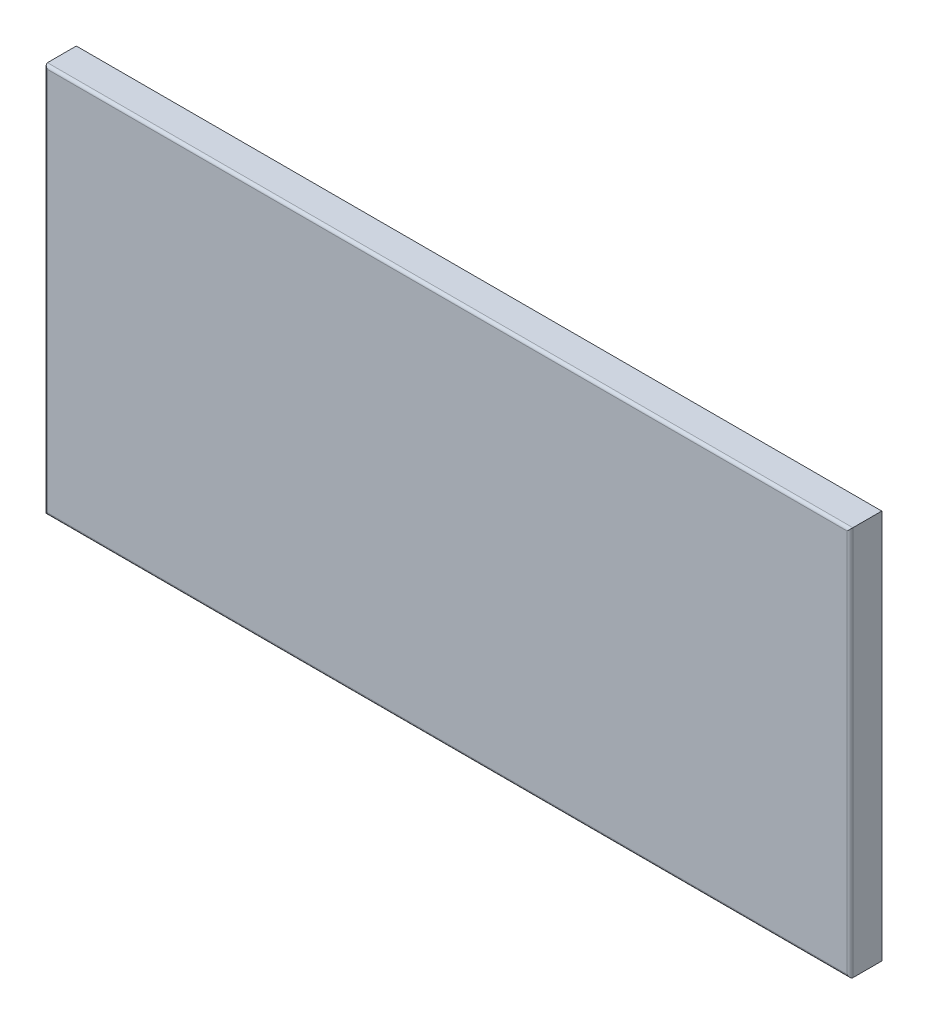
ISO-10303-21;
HEADER;
FILE_DESCRIPTION(('STEP AP214'),'2;1');
FILE_NAME('part.step','',(''),(''),'','','');
FILE_SCHEMA(('AUTOMOTIVE_DESIGN { 1 0 10303 214 1 1 1 1 }'));
ENDSEC;
DATA;
#1=APPLICATION_CONTEXT('core data for automotive mechanical design processes');
#2=APPLICATION_PROTOCOL_DEFINITION('international standard','automotive_design',2000,#1);
#3=PRODUCT_CONTEXT('',#1,'mechanical');
#4=PRODUCT('Part','Part','',(#3));
#5=PRODUCT_RELATED_PRODUCT_CATEGORY('part','',(#4));
#6=PRODUCT_DEFINITION_FORMATION('','',#4);
#7=PRODUCT_DEFINITION_CONTEXT('part definition',#1,'design');
#8=PRODUCT_DEFINITION('design','',#6,#7);
#9=PRODUCT_DEFINITION_SHAPE('','',#8);
#10=(LENGTH_UNIT() NAMED_UNIT(*) SI_UNIT(.MILLI.,.METRE.));
#11=(NAMED_UNIT(*) PLANE_ANGLE_UNIT() SI_UNIT($,.RADIAN.));
#12=(NAMED_UNIT(*) SI_UNIT($,.STERADIAN.) SOLID_ANGLE_UNIT());
#13=UNCERTAINTY_MEASURE_WITH_UNIT(LENGTH_MEASURE(1.E-05),#10,'distance_accuracy_value','');
#14=(GEOMETRIC_REPRESENTATION_CONTEXT(3) GLOBAL_UNCERTAINTY_ASSIGNED_CONTEXT((#13)) GLOBAL_UNIT_ASSIGNED_CONTEXT((#10,
#11,#12)) REPRESENTATION_CONTEXT('',''));
#15=CARTESIAN_POINT('',(0.,0.,0.));
#16=DIRECTION('',(0.,0.,1.));
#17=DIRECTION('',(1.,0.,0.));
#18=AXIS2_PLACEMENT_3D('',#15,#16,#17);
#19=CARTESIAN_POINT('',(0.,0.,1.1));
#20=DIRECTION('',(1.,0.,0.));
#21=DIRECTION('',(0.,1.,0.));
#22=AXIS2_PLACEMENT_3D('',#19,#20,#21);
#23=PLANE('',#22);
#24=DIRECTION('',(0.,0.,-1.));
#25=VECTOR('',#24,1.);
#26=CARTESIAN_POINT('',(0.,0.,1.1));
#27=LINE('',#26,#25);
#28=CARTESIAN_POINT('',(0.,0.,1.));
#29=VERTEX_POINT('',#28);
#30=CARTESIAN_POINT('',(0.,0.,0.));
#31=VERTEX_POINT('',#30);
#32=EDGE_CURVE('E90',#29,#31,#27,.T.);
#33=ORIENTED_EDGE('',*,*,#32,.F.);
#34=DIRECTION('',(0.,-1.,0.));
#35=VECTOR('',#34,1.);
#36=CARTESIAN_POINT('',(0.,0.,1.));
#37=LINE('',#36,#35);
#38=CARTESIAN_POINT('',(0.,13.5,1.));
#39=VERTEX_POINT('',#38);
#40=EDGE_CURVE('E48',#29,#39,#37,.F.);
#41=ORIENTED_EDGE('',*,*,#40,.T.);
#42=DIRECTION('',(0.,0.,-1.));
#43=VECTOR('',#42,1.);
#44=CARTESIAN_POINT('',(0.,13.5,1.1));
#45=LINE('',#44,#43);
#46=CARTESIAN_POINT('',(0.,13.5,0.));
#47=VERTEX_POINT('',#46);
#48=EDGE_CURVE('E109',#39,#47,#45,.T.);
#49=ORIENTED_EDGE('',*,*,#48,.T.);
#50=DIRECTION('',(0.,-1.,0.));
#51=VECTOR('',#50,1.);
#52=CARTESIAN_POINT('',(0.,0.,0.));
#53=LINE('',#52,#51);
#54=EDGE_CURVE('E104',#47,#31,#53,.T.);
#55=ORIENTED_EDGE('',*,*,#54,.T.);
#56=EDGE_LOOP('',(#33,#41,#49,#55));
#57=FACE_BOUND('',#56,.T.);
#58=ADVANCED_FACE('F38',(#57),#23,.F.);
#59=CARTESIAN_POINT('',(0.,0.,1.1));
#60=DIRECTION('',(0.,1.,0.));
#61=DIRECTION('',(0.,0.,1.));
#62=AXIS2_PLACEMENT_3D('',#59,#60,#61);
#63=PLANE('',#62);
#64=DIRECTION('',(0.,0.,-1.));
#65=VECTOR('',#64,1.);
#66=CARTESIAN_POINT('',(27.9,0.,1.1));
#67=LINE('',#66,#65);
#68=CARTESIAN_POINT('',(27.9,0.,1.));
#69=VERTEX_POINT('',#68);
#70=CARTESIAN_POINT('',(27.9,0.,0.));
#71=VERTEX_POINT('',#70);
#72=EDGE_CURVE('E98',#69,#71,#67,.T.);
#73=ORIENTED_EDGE('',*,*,#72,.F.);
#74=DIRECTION('',(1.,0.,0.));
#75=VECTOR('',#74,1.);
#76=CARTESIAN_POINT('',(0.,0.,1.));
#77=LINE('',#76,#75);
#78=EDGE_CURVE('E11',#69,#29,#77,.F.);
#79=ORIENTED_EDGE('',*,*,#78,.T.);
#80=ORIENTED_EDGE('',*,*,#32,.T.);
#81=DIRECTION('',(1.,0.,0.));
#82=VECTOR('',#81,1.);
#83=CARTESIAN_POINT('',(0.,0.,0.));
#84=LINE('',#83,#82);
#85=EDGE_CURVE('E93',#31,#71,#84,.T.);
#86=ORIENTED_EDGE('',*,*,#85,.T.);
#87=EDGE_LOOP('',(#73,#79,#80,#86));
#88=FACE_BOUND('',#87,.T.);
#89=ADVANCED_FACE('F92',(#88),#63,.F.);
#90=CARTESIAN_POINT('',(27.9,0.,1.1));
#91=DIRECTION('',(-1.,0.,0.));
#92=DIRECTION('',(0.,-1.,0.));
#93=AXIS2_PLACEMENT_3D('',#90,#91,#92);
#94=PLANE('',#93);
#95=DIRECTION('',(0.,0.,-1.));
#96=VECTOR('',#95,1.);
#97=CARTESIAN_POINT('',(27.9,13.5,1.1));
#98=LINE('',#97,#96);
#99=CARTESIAN_POINT('',(27.9,13.5,1.));
#100=VERTEX_POINT('',#99);
#101=CARTESIAN_POINT('',(27.9,13.5,0.));
#102=VERTEX_POINT('',#101);
#103=EDGE_CURVE('E124',#100,#102,#98,.T.);
#104=ORIENTED_EDGE('',*,*,#103,.F.);
#105=DIRECTION('',(0.,1.,0.));
#106=VECTOR('',#105,1.);
#107=CARTESIAN_POINT('',(27.9,0.,1.));
#108=LINE('',#107,#106);
#109=EDGE_CURVE('E141',#100,#69,#108,.F.);
#110=ORIENTED_EDGE('',*,*,#109,.T.);
#111=ORIENTED_EDGE('',*,*,#72,.T.);
#112=DIRECTION('',(0.,1.,0.));
#113=VECTOR('',#112,1.);
#114=CARTESIAN_POINT('',(27.9,0.,0.));
#115=LINE('',#114,#113);
#116=EDGE_CURVE('E106',#71,#102,#115,.T.);
#117=ORIENTED_EDGE('',*,*,#116,.T.);
#118=EDGE_LOOP('',(#104,#110,#111,#117));
#119=FACE_BOUND('',#118,.T.);
#120=ADVANCED_FACE('F176',(#119),#94,.F.);
#121=CARTESIAN_POINT('',(0.,13.5,1.1));
#122=DIRECTION('',(0.,-1.,0.));
#123=DIRECTION('',(0.,0.,-1.));
#124=AXIS2_PLACEMENT_3D('',#121,#122,#123);
#125=PLANE('',#124);
#126=ORIENTED_EDGE('',*,*,#48,.F.);
#127=DIRECTION('',(-1.,0.,0.));
#128=VECTOR('',#127,1.);
#129=CARTESIAN_POINT('',(0.,13.5,1.));
#130=LINE('',#129,#128);
#131=EDGE_CURVE('E145',#39,#100,#130,.F.);
#132=ORIENTED_EDGE('',*,*,#131,.T.);
#133=ORIENTED_EDGE('',*,*,#103,.T.);
#134=DIRECTION('',(-1.,0.,0.));
#135=VECTOR('',#134,1.);
#136=CARTESIAN_POINT('',(0.,13.5,0.));
#137=LINE('',#136,#135);
#138=EDGE_CURVE('E119',#102,#47,#137,.T.);
#139=ORIENTED_EDGE('',*,*,#138,.T.);
#140=EDGE_LOOP('',(#126,#132,#133,#139));
#141=FACE_BOUND('',#140,.T.);
#142=ADVANCED_FACE('F178',(#141),#125,.F.);
#143=CARTESIAN_POINT('',(0.,0.,1.1));
#144=DIRECTION('',(0.,0.,-1.));
#145=DIRECTION('',(-1.,0.,0.));
#146=AXIS2_PLACEMENT_3D('',#143,#144,#145);
#147=PLANE('',#146);
#148=DIRECTION('',(1.,0.,0.));
#149=VECTOR('',#148,1.);
#150=CARTESIAN_POINT('',(0.,0.1,1.1));
#151=LINE('',#150,#149);
#152=CARTESIAN_POINT('',(0.1,0.1,1.1));
#153=VERTEX_POINT('',#152);
#154=CARTESIAN_POINT('',(27.8,0.1,1.1));
#155=VERTEX_POINT('',#154);
#156=EDGE_CURVE('E97',#153,#155,#151,.T.);
#157=ORIENTED_EDGE('',*,*,#156,.T.);
#158=DIRECTION('',(0.,1.,0.));
#159=VECTOR('',#158,1.);
#160=CARTESIAN_POINT('',(27.8,0.,1.1));
#161=LINE('',#160,#159);
#162=CARTESIAN_POINT('',(27.8,13.4,1.1));
#163=VERTEX_POINT('',#162);
#164=EDGE_CURVE('E137',#155,#163,#161,.T.);
#165=ORIENTED_EDGE('',*,*,#164,.T.);
#166=DIRECTION('',(-1.,0.,0.));
#167=VECTOR('',#166,1.);
#168=CARTESIAN_POINT('',(0.,13.4,1.1));
#169=LINE('',#168,#167);
#170=CARTESIAN_POINT('',(0.0999999999999966,13.4,1.1));
#171=VERTEX_POINT('',#170);
#172=EDGE_CURVE('E134',#163,#171,#169,.T.);
#173=ORIENTED_EDGE('',*,*,#172,.T.);
#174=DIRECTION('',(0.,-1.,0.));
#175=VECTOR('',#174,1.);
#176=CARTESIAN_POINT('',(0.1,0.,1.1));
#177=LINE('',#176,#175);
#178=EDGE_CURVE('E131',#171,#153,#177,.T.);
#179=ORIENTED_EDGE('',*,*,#178,.T.);
#180=EDGE_LOOP('',(#157,#165,#173,#179));
#181=FACE_BOUND('',#180,.T.);
#182=ADVANCED_FACE('F168',(#181),#147,.F.);
#183=CARTESIAN_POINT('',(0.,0.,0.));
#184=DIRECTION('',(0.,0.,-1.));
#185=DIRECTION('',(-1.,0.,0.));
#186=AXIS2_PLACEMENT_3D('',#183,#184,#185);
#187=PLANE('',#186);
#188=ORIENTED_EDGE('',*,*,#54,.F.);
#189=ORIENTED_EDGE('',*,*,#138,.F.);
#190=ORIENTED_EDGE('',*,*,#116,.F.);
#191=ORIENTED_EDGE('',*,*,#85,.F.);
#192=EDGE_LOOP('',(#188,#189,#190,#191));
#193=FACE_BOUND('',#192,.T.);
#194=ADVANCED_FACE('F102',(#193),#187,.T.);
#195=CARTESIAN_POINT('',(0.1,0.,1.));
#196=DIRECTION('',(0.,-1.,0.));
#197=DIRECTION('',(1.,0.,0.));
#198=AXIS2_PLACEMENT_3D('',#195,#196,#197);
#199=CYLINDRICAL_SURFACE('',#198,0.1);
#200=CARTESIAN_POINT('',(0.0999999999999966,13.4,1.));
#201=DIRECTION('',(-0.707106781186547,-0.707106781186548,0.));
#202=DIRECTION('',(0.707106781186548,-0.707106781186547,0.));
#203=AXIS2_PLACEMENT_3D('',#200,#201,#202);
#204=ELLIPSE('',#203,0.14142135623731,0.1);
#205=EDGE_CURVE('E115',#39,#171,#204,.F.);
#206=ORIENTED_EDGE('',*,*,#205,.F.);
#207=ORIENTED_EDGE('',*,*,#40,.F.);
#208=CARTESIAN_POINT('',(0.1,0.1,1.));
#209=DIRECTION('',(0.707106781186548,-0.707106781186547,0.));
#210=DIRECTION('',(0.707106781186547,0.707106781186548,0.));
#211=AXIS2_PLACEMENT_3D('',#208,#209,#210);
#212=ELLIPSE('',#211,0.14142135623731,0.1);
#213=EDGE_CURVE('E42',#153,#29,#212,.T.);
#214=ORIENTED_EDGE('',*,*,#213,.F.);
#215=ORIENTED_EDGE('',*,*,#178,.F.);
#216=EDGE_LOOP('',(#206,#207,#214,#215));
#217=FACE_BOUND('',#216,.T.);
#218=ADVANCED_FACE('F40',(#217),#199,.T.);
#219=CARTESIAN_POINT('',(0.,0.1,1.));
#220=DIRECTION('',(1.,0.,0.));
#221=DIRECTION('',(0.,0.,-1.));
#222=AXIS2_PLACEMENT_3D('',#219,#220,#221);
#223=CYLINDRICAL_SURFACE('',#222,0.1);
#224=ORIENTED_EDGE('',*,*,#213,.T.);
#225=ORIENTED_EDGE('',*,*,#78,.F.);
#226=CARTESIAN_POINT('',(27.8,0.1,1.));
#227=DIRECTION('',(0.707106781186547,0.707106781186548,0.));
#228=DIRECTION('',(0.707106781186548,-0.707106781186547,0.));
#229=AXIS2_PLACEMENT_3D('',#226,#227,#228);
#230=ELLIPSE('',#229,0.14142135623731,0.1);
#231=EDGE_CURVE('E153',#155,#69,#230,.T.);
#232=ORIENTED_EDGE('',*,*,#231,.F.);
#233=ORIENTED_EDGE('',*,*,#156,.F.);
#234=EDGE_LOOP('',(#224,#225,#232,#233));
#235=FACE_BOUND('',#234,.T.);
#236=ADVANCED_FACE('F199',(#235),#223,.T.);
#237=CARTESIAN_POINT('',(0.,13.4,1.));
#238=DIRECTION('',(-1.,0.,0.));
#239=DIRECTION('',(0.,0.,1.));
#240=AXIS2_PLACEMENT_3D('',#237,#238,#239);
#241=CYLINDRICAL_SURFACE('',#240,0.1);
#242=ORIENTED_EDGE('',*,*,#205,.T.);
#243=ORIENTED_EDGE('',*,*,#172,.F.);
#244=CARTESIAN_POINT('',(27.8,13.4,1.));
#245=DIRECTION('',(-0.707106781186548,0.707106781186547,0.));
#246=DIRECTION('',(-0.707106781186547,-0.707106781186548,0.));
#247=AXIS2_PLACEMENT_3D('',#244,#245,#246);
#248=ELLIPSE('',#247,0.141421356237309,0.1);
#249=EDGE_CURVE('E150',#100,#163,#248,.F.);
#250=ORIENTED_EDGE('',*,*,#249,.F.);
#251=ORIENTED_EDGE('',*,*,#131,.F.);
#252=EDGE_LOOP('',(#242,#243,#250,#251));
#253=FACE_BOUND('',#252,.T.);
#254=ADVANCED_FACE('F161',(#253),#241,.T.);
#255=CARTESIAN_POINT('',(27.8,0.,1.));
#256=DIRECTION('',(0.,1.,0.));
#257=DIRECTION('',(-1.,0.,0.));
#258=AXIS2_PLACEMENT_3D('',#255,#256,#257);
#259=CYLINDRICAL_SURFACE('',#258,0.1);
#260=ORIENTED_EDGE('',*,*,#231,.T.);
#261=ORIENTED_EDGE('',*,*,#109,.F.);
#262=ORIENTED_EDGE('',*,*,#249,.T.);
#263=ORIENTED_EDGE('',*,*,#164,.F.);
#264=EDGE_LOOP('',(#260,#261,#262,#263));
#265=FACE_BOUND('',#264,.T.);
#266=ADVANCED_FACE('F172',(#265),#259,.T.);
#267=CLOSED_SHELL('',(#58,#89,#120,#142,#182,#194,#218,#236,#254,#266));
#268=MANIFOLD_SOLID_BREP('B2',#267);
#269=ADVANCED_BREP_SHAPE_REPRESENTATION('',(#18,#268),#14);
#270=SHAPE_DEFINITION_REPRESENTATION(#9,#269);
ENDSEC;
END-ISO-10303-21;
